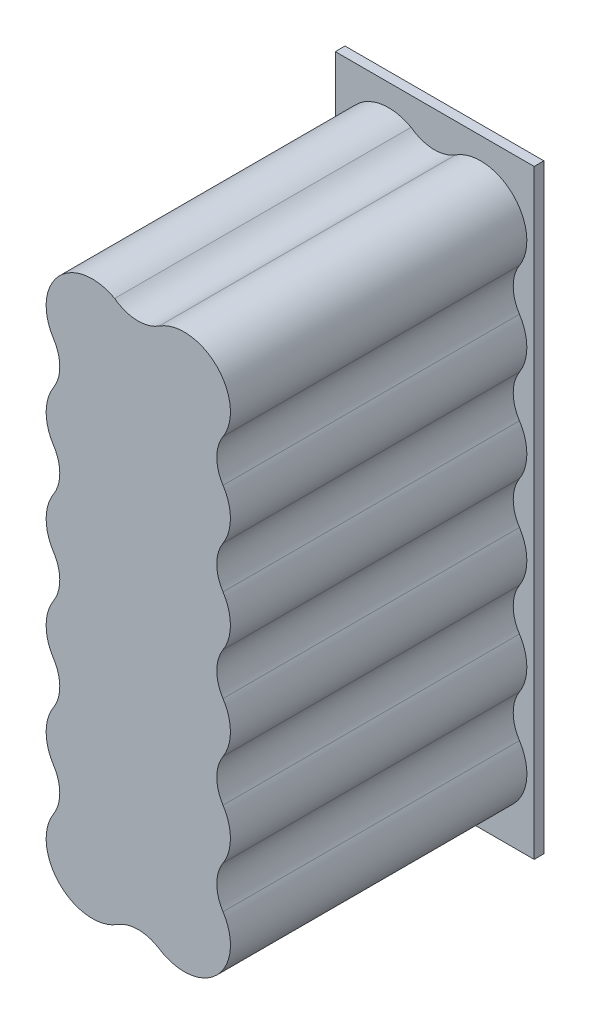
ISO-10303-21;
HEADER;
FILE_DESCRIPTION(('STEP AP214'),'2;1');
FILE_NAME('part.step','',(''),(''),'','','');
FILE_SCHEMA(('AUTOMOTIVE_DESIGN { 1 0 10303 214 1 1 1 1 }'));
ENDSEC;
DATA;
#1=APPLICATION_CONTEXT('core data for automotive mechanical design processes');
#2=APPLICATION_PROTOCOL_DEFINITION('international standard','automotive_design',2000,#1);
#3=PRODUCT_CONTEXT('',#1,'mechanical');
#4=PRODUCT('Part','Part','',(#3));
#5=PRODUCT_RELATED_PRODUCT_CATEGORY('part','',(#4));
#6=PRODUCT_DEFINITION_FORMATION('','',#4);
#7=PRODUCT_DEFINITION_CONTEXT('part definition',#1,'design');
#8=PRODUCT_DEFINITION('design','',#6,#7);
#9=PRODUCT_DEFINITION_SHAPE('','',#8);
#10=(LENGTH_UNIT() NAMED_UNIT(*) SI_UNIT(.MILLI.,.METRE.));
#11=(NAMED_UNIT(*) PLANE_ANGLE_UNIT() SI_UNIT($,.RADIAN.));
#12=(NAMED_UNIT(*) SI_UNIT($,.STERADIAN.) SOLID_ANGLE_UNIT());
#13=UNCERTAINTY_MEASURE_WITH_UNIT(LENGTH_MEASURE(1.E-05),#10,'distance_accuracy_value','');
#14=(GEOMETRIC_REPRESENTATION_CONTEXT(3) GLOBAL_UNCERTAINTY_ASSIGNED_CONTEXT((#13)) GLOBAL_UNIT_ASSIGNED_CONTEXT((#10,
#11,#12)) REPRESENTATION_CONTEXT('',''));
#15=CARTESIAN_POINT('',(0.,0.,0.));
#16=DIRECTION('',(0.,0.,1.));
#17=DIRECTION('',(1.,0.,0.));
#18=AXIS2_PLACEMENT_3D('',#15,#16,#17);
#19=CARTESIAN_POINT('',(0.639103561925076,46.8185253075974,61.));
#20=DIRECTION('',(0.,0.,-1.));
#21=DIRECTION('',(-1.,0.,0.));
#22=AXIS2_PLACEMENT_3D('',#19,#20,#21);
#23=CYLINDRICAL_SURFACE('',#22,8.);
#24=CARTESIAN_POINT('',(0.639103561925076,46.8185253075974,0.));
#25=DIRECTION('',(0.,0.,1.));
#26=DIRECTION('',(1.,0.,0.));
#27=AXIS2_PLACEMENT_3D('',#24,#25,#26);
#28=CIRCLE('',#27,8.);
#29=CARTESIAN_POINT('',(-4.18637409994036,40.4377130289892,0.));
#30=VERTEX_POINT('',#29);
#31=CARTESIAN_POINT('',(4.98196070478159,40.0999248702489,0.));
#32=VERTEX_POINT('',#31);
#33=EDGE_CURVE('E243',#30,#32,#28,.T.);
#34=ORIENTED_EDGE('',*,*,#33,.F.);
#35=DIRECTION('',(0.,0.,-1.));
#36=VECTOR('',#35,1.);
#37=CARTESIAN_POINT('',(-4.18637409994036,40.4377130289892,61.));
#38=LINE('',#37,#36);
#39=CARTESIAN_POINT('',(-4.18637409994036,40.4377130289892,61.));
#40=VERTEX_POINT('',#39);
#41=EDGE_CURVE('E11',#40,#30,#38,.T.);
#42=ORIENTED_EDGE('',*,*,#41,.F.);
#43=CARTESIAN_POINT('',(0.639103561925076,46.8185253075974,61.));
#44=DIRECTION('',(0.,0.,1.));
#45=DIRECTION('',(1.,0.,0.));
#46=AXIS2_PLACEMENT_3D('',#43,#44,#45);
#47=CIRCLE('',#46,8.);
#48=CARTESIAN_POINT('',(4.98196070478159,40.0999248702489,61.));
#49=VERTEX_POINT('',#48);
#50=EDGE_CURVE('E251',#40,#49,#47,.T.);
#51=ORIENTED_EDGE('',*,*,#50,.T.);
#52=DIRECTION('',(0.,0.,-1.));
#53=VECTOR('',#52,1.);
#54=CARTESIAN_POINT('',(4.98196070478159,40.0999248702489,61.));
#55=LINE('',#54,#53);
#56=EDGE_CURVE('E304',#49,#32,#55,.T.);
#57=ORIENTED_EDGE('',*,*,#56,.T.);
#58=EDGE_LOOP('',(#34,#42,#51,#57));
#59=FACE_BOUND('',#58,.T.);
#60=ADVANCED_FACE('F37',(#59),#23,.F.);
#61=CARTESIAN_POINT('',(-8.77898178948647,32.1215868508987,61.));
#62=DIRECTION('',(0.,0.,-1.));
#63=DIRECTION('',(-1.,0.,0.));
#64=AXIS2_PLACEMENT_3D('',#61,#62,#63);
#65=CYLINDRICAL_SURFACE('',#64,9.50000000000002);
#66=CARTESIAN_POINT('',(-8.77898178948647,32.1215868508987,0.));
#67=DIRECTION('',(0.,0.,1.));
#68=DIRECTION('',(1.,0.,0.));
#69=AXIS2_PLACEMENT_3D('',#66,#67,#68);
#70=CIRCLE('',#69,9.50000000000002);
#71=CARTESIAN_POINT('',(-16.8424232068559,27.0985486757848,0.));
#72=VERTEX_POINT('',#71);
#73=EDGE_CURVE('E245',#30,#72,#70,.T.);
#74=ORIENTED_EDGE('',*,*,#73,.T.);
#75=DIRECTION('',(0.,0.,-1.));
#76=VECTOR('',#75,1.);
#77=CARTESIAN_POINT('',(-16.8424232068559,27.0985486757848,61.));
#78=LINE('',#77,#76);
#79=CARTESIAN_POINT('',(-16.8424232068559,27.0985486757848,61.));
#80=VERTEX_POINT('',#79);
#81=EDGE_CURVE('E45',#80,#72,#78,.T.);
#82=ORIENTED_EDGE('',*,*,#81,.F.);
#83=CARTESIAN_POINT('',(-8.77898178948647,32.1215868508987,61.));
#84=DIRECTION('',(0.,0.,1.));
#85=DIRECTION('',(1.,0.,0.));
#86=AXIS2_PLACEMENT_3D('',#83,#84,#85);
#87=CIRCLE('',#86,9.50000000000002);
#88=EDGE_CURVE('E254',#40,#80,#87,.T.);
#89=ORIENTED_EDGE('',*,*,#88,.F.);
#90=ORIENTED_EDGE('',*,*,#41,.T.);
#91=EDGE_LOOP('',(#74,#82,#89,#90));
#92=FACE_BOUND('',#91,.T.);
#93=ADVANCED_FACE('F441',(#92),#65,.T.);
#94=CARTESIAN_POINT('',(-23.4742061491038,22.6242381135965,61.));
#95=DIRECTION('',(0.,0.,-1.));
#96=DIRECTION('',(-1.,0.,0.));
#97=AXIS2_PLACEMENT_3D('',#94,#95,#96);
#98=CYLINDRICAL_SURFACE('',#97,8.);
#99=CARTESIAN_POINT('',(-23.4742061491038,22.6242381135965,0.));
#100=DIRECTION('',(0.,0.,1.));
#101=DIRECTION('',(1.,0.,0.));
#102=AXIS2_PLACEMENT_3D('',#99,#100,#101);
#103=CIRCLE('',#102,8.);
#104=CARTESIAN_POINT('',(-16.7563892989923,18.2801689649336,0.));
#105=VERTEX_POINT('',#104);
#106=EDGE_CURVE('E308',#72,#105,#103,.F.);
#107=ORIENTED_EDGE('',*,*,#106,.T.);
#108=DIRECTION('',(0.,0.,-1.));
#109=VECTOR('',#108,1.);
#110=CARTESIAN_POINT('',(-16.7563892989923,18.2801689649336,61.));
#111=LINE('',#110,#109);
#112=CARTESIAN_POINT('',(-16.7563892989923,18.2801689649336,61.));
#113=VERTEX_POINT('',#112);
#114=EDGE_CURVE('E430',#113,#105,#111,.T.);
#115=ORIENTED_EDGE('',*,*,#114,.F.);
#116=CARTESIAN_POINT('',(-23.4742061491038,22.6242381135965,61.));
#117=DIRECTION('',(0.,0.,1.));
#118=DIRECTION('',(1.,0.,0.));
#119=AXIS2_PLACEMENT_3D('',#116,#117,#118);
#120=CIRCLE('',#119,8.);
#121=EDGE_CURVE('E257',#80,#113,#120,.F.);
#122=ORIENTED_EDGE('',*,*,#121,.F.);
#123=ORIENTED_EDGE('',*,*,#81,.T.);
#124=EDGE_LOOP('',(#107,#115,#122,#123));
#125=FACE_BOUND('',#124,.T.);
#126=ADVANCED_FACE('F436',(#125),#98,.F.);
#127=CARTESIAN_POINT('',(-8.77898178948629,13.1215868508973,61.));
#128=DIRECTION('',(0.,0.,-1.));
#129=DIRECTION('',(-1.,0.,0.));
#130=AXIS2_PLACEMENT_3D('',#127,#128,#129);
#131=CYLINDRICAL_SURFACE('',#130,9.49999999999882);
#132=CARTESIAN_POINT('',(-8.77898178948629,13.1215868508973,0.));
#133=DIRECTION('',(0.,0.,1.));
#134=DIRECTION('',(1.,0.,0.));
#135=AXIS2_PLACEMENT_3D('',#132,#133,#134);
#136=CIRCLE('',#135,9.49999999999882);
#137=CARTESIAN_POINT('',(-16.8424232068561,8.09854867578633,0.));
#138=VERTEX_POINT('',#137);
#139=EDGE_CURVE('E311',#105,#138,#136,.T.);
#140=ORIENTED_EDGE('',*,*,#139,.T.);
#141=DIRECTION('',(0.,0.,-1.));
#142=VECTOR('',#141,1.);
#143=CARTESIAN_POINT('',(-16.8424232068561,8.09854867578633,61.));
#144=LINE('',#143,#142);
#145=CARTESIAN_POINT('',(-16.8424232068561,8.09854867578633,61.));
#146=VERTEX_POINT('',#145);
#147=EDGE_CURVE('E427',#146,#138,#144,.T.);
#148=ORIENTED_EDGE('',*,*,#147,.F.);
#149=CARTESIAN_POINT('',(-8.77898178948629,13.1215868508973,61.));
#150=DIRECTION('',(0.,0.,1.));
#151=DIRECTION('',(1.,0.,0.));
#152=AXIS2_PLACEMENT_3D('',#149,#150,#151);
#153=CIRCLE('',#152,9.49999999999882);
#154=EDGE_CURVE('E259',#113,#146,#153,.T.);
#155=ORIENTED_EDGE('',*,*,#154,.F.);
#156=ORIENTED_EDGE('',*,*,#114,.T.);
#157=EDGE_LOOP('',(#140,#148,#155,#156));
#158=FACE_BOUND('',#157,.T.);
#159=ADVANCED_FACE('F447',(#158),#131,.T.);
#160=CARTESIAN_POINT('',(-23.4742061491036,3.62423811359826,61.));
#161=DIRECTION('',(0.,0.,-1.));
#162=DIRECTION('',(-1.,0.,0.));
#163=AXIS2_PLACEMENT_3D('',#160,#161,#162);
#164=CYLINDRICAL_SURFACE('',#163,8.00000000000009);
#165=CARTESIAN_POINT('',(-23.4742061491036,3.62423811359826,0.));
#166=DIRECTION('',(0.,0.,1.));
#167=DIRECTION('',(1.,0.,0.));
#168=AXIS2_PLACEMENT_3D('',#165,#166,#167);
#169=CIRCLE('',#168,8.00000000000009);
#170=CARTESIAN_POINT('',(-16.7563892989925,-0.719831035064275,0.));
#171=VERTEX_POINT('',#170);
#172=EDGE_CURVE('E314',#138,#171,#169,.F.);
#173=ORIENTED_EDGE('',*,*,#172,.T.);
#174=DIRECTION('',(0.,0.,-1.));
#175=VECTOR('',#174,1.);
#176=CARTESIAN_POINT('',(-16.7563892989925,-0.719831035064275,61.));
#177=LINE('',#176,#175);
#178=CARTESIAN_POINT('',(-16.7563892989925,-0.719831035064275,61.));
#179=VERTEX_POINT('',#178);
#180=EDGE_CURVE('E424',#179,#171,#177,.T.);
#181=ORIENTED_EDGE('',*,*,#180,.F.);
#182=CARTESIAN_POINT('',(-23.4742061491036,3.62423811359826,61.));
#183=DIRECTION('',(0.,0.,1.));
#184=DIRECTION('',(1.,0.,0.));
#185=AXIS2_PLACEMENT_3D('',#182,#183,#184);
#186=CIRCLE('',#185,8.00000000000009);
#187=EDGE_CURVE('E261',#146,#179,#186,.F.);
#188=ORIENTED_EDGE('',*,*,#187,.F.);
#189=ORIENTED_EDGE('',*,*,#147,.T.);
#190=EDGE_LOOP('',(#173,#181,#188,#189));
#191=FACE_BOUND('',#190,.T.);
#192=ADVANCED_FACE('F451',(#191),#164,.F.);
#193=CARTESIAN_POINT('',(-8.77898178948593,-5.87841314910006,61.));
#194=DIRECTION('',(0.,0.,-1.));
#195=DIRECTION('',(-1.,0.,0.));
#196=AXIS2_PLACEMENT_3D('',#193,#194,#195);
#197=CYLINDRICAL_SURFACE('',#196,9.49999999999903);
#198=CARTESIAN_POINT('',(-8.77898178948593,-5.87841314910006,0.));
#199=DIRECTION('',(0.,0.,1.));
#200=DIRECTION('',(1.,0.,0.));
#201=AXIS2_PLACEMENT_3D('',#198,#199,#200);
#202=CIRCLE('',#201,9.49999999999903);
#203=CARTESIAN_POINT('',(-16.8424232068553,-10.9014513242122,0.));
#204=VERTEX_POINT('',#203);
#205=EDGE_CURVE('E317',#171,#204,#202,.T.);
#206=ORIENTED_EDGE('',*,*,#205,.T.);
#207=DIRECTION('',(0.,0.,-1.));
#208=VECTOR('',#207,1.);
#209=CARTESIAN_POINT('',(-16.8424232068553,-10.9014513242122,61.));
#210=LINE('',#209,#208);
#211=CARTESIAN_POINT('',(-16.8424232068553,-10.9014513242122,61.));
#212=VERTEX_POINT('',#211);
#213=EDGE_CURVE('E421',#212,#204,#210,.T.);
#214=ORIENTED_EDGE('',*,*,#213,.F.);
#215=CARTESIAN_POINT('',(-8.77898178948593,-5.87841314910006,61.));
#216=DIRECTION('',(0.,0.,1.));
#217=DIRECTION('',(1.,0.,0.));
#218=AXIS2_PLACEMENT_3D('',#215,#216,#217);
#219=CIRCLE('',#218,9.49999999999903);
#220=EDGE_CURVE('E263',#179,#212,#219,.T.);
#221=ORIENTED_EDGE('',*,*,#220,.F.);
#222=ORIENTED_EDGE('',*,*,#180,.T.);
#223=EDGE_LOOP('',(#206,#214,#221,#222));
#224=FACE_BOUND('',#223,.T.);
#225=ADVANCED_FACE('F527',(#224),#197,.T.);
#226=CARTESIAN_POINT('',(-23.4742061491034,-15.3757618864006,61.));
#227=DIRECTION('',(0.,0.,-1.));
#228=DIRECTION('',(-1.,0.,0.));
#229=AXIS2_PLACEMENT_3D('',#226,#227,#228);
#230=CYLINDRICAL_SURFACE('',#229,8.);
#231=CARTESIAN_POINT('',(-23.4742061491034,-15.3757618864006,0.));
#232=DIRECTION('',(0.,0.,1.));
#233=DIRECTION('',(1.,0.,0.));
#234=AXIS2_PLACEMENT_3D('',#231,#232,#233);
#235=CIRCLE('',#234,8.);
#236=CARTESIAN_POINT('',(-16.7563892989921,-19.719831035063,0.));
#237=VERTEX_POINT('',#236);
#238=EDGE_CURVE('E320',#204,#237,#235,.F.);
#239=ORIENTED_EDGE('',*,*,#238,.T.);
#240=DIRECTION('',(0.,0.,-1.));
#241=VECTOR('',#240,1.);
#242=CARTESIAN_POINT('',(-16.7563892989921,-19.719831035063,61.));
#243=LINE('',#242,#241);
#244=CARTESIAN_POINT('',(-16.7563892989921,-19.719831035063,61.));
#245=VERTEX_POINT('',#244);
#246=EDGE_CURVE('E418',#245,#237,#243,.T.);
#247=ORIENTED_EDGE('',*,*,#246,.F.);
#248=CARTESIAN_POINT('',(-23.4742061491034,-15.3757618864006,61.));
#249=DIRECTION('',(0.,0.,1.));
#250=DIRECTION('',(1.,0.,0.));
#251=AXIS2_PLACEMENT_3D('',#248,#249,#250);
#252=CIRCLE('',#251,8.);
#253=EDGE_CURVE('E265',#212,#245,#252,.F.);
#254=ORIENTED_EDGE('',*,*,#253,.F.);
#255=ORIENTED_EDGE('',*,*,#213,.T.);
#256=EDGE_LOOP('',(#239,#247,#254,#255));
#257=FACE_BOUND('',#256,.T.);
#258=ADVANCED_FACE('F524',(#257),#230,.F.);
#259=CARTESIAN_POINT('',(-8.77898178948542,-24.8784131490991,61.));
#260=DIRECTION('',(0.,0.,-1.));
#261=DIRECTION('',(-1.,0.,0.));
#262=AXIS2_PLACEMENT_3D('',#259,#260,#261);
#263=CYLINDRICAL_SURFACE('',#262,9.49999999999929);
#264=CARTESIAN_POINT('',(-8.77898178948542,-24.8784131490991,0.));
#265=DIRECTION('',(0.,0.,1.));
#266=DIRECTION('',(1.,0.,0.));
#267=AXIS2_PLACEMENT_3D('',#264,#265,#266);
#268=CIRCLE('',#267,9.49999999999929);
#269=CARTESIAN_POINT('',(-16.8424232068553,-29.9014513242109,0.));
#270=VERTEX_POINT('',#269);
#271=EDGE_CURVE('E323',#237,#270,#268,.T.);
#272=ORIENTED_EDGE('',*,*,#271,.T.);
#273=DIRECTION('',(0.,0.,-1.));
#274=VECTOR('',#273,1.);
#275=CARTESIAN_POINT('',(-16.8424232068553,-29.9014513242109,61.));
#276=LINE('',#275,#274);
#277=CARTESIAN_POINT('',(-16.8424232068553,-29.9014513242109,61.));
#278=VERTEX_POINT('',#277);
#279=EDGE_CURVE('E415',#278,#270,#276,.T.);
#280=ORIENTED_EDGE('',*,*,#279,.F.);
#281=CARTESIAN_POINT('',(-8.77898178948542,-24.8784131490991,61.));
#282=DIRECTION('',(0.,0.,1.));
#283=DIRECTION('',(1.,0.,0.));
#284=AXIS2_PLACEMENT_3D('',#281,#282,#283);
#285=CIRCLE('',#284,9.49999999999929);
#286=EDGE_CURVE('E267',#245,#278,#285,.T.);
#287=ORIENTED_EDGE('',*,*,#286,.F.);
#288=ORIENTED_EDGE('',*,*,#246,.T.);
#289=EDGE_LOOP('',(#272,#280,#287,#288));
#290=FACE_BOUND('',#289,.T.);
#291=ADVANCED_FACE('F521',(#290),#263,.T.);
#292=CARTESIAN_POINT('',(-23.4742061491032,-34.3757618863992,61.));
#293=DIRECTION('',(0.,0.,-1.));
#294=DIRECTION('',(-1.,0.,0.));
#295=AXIS2_PLACEMENT_3D('',#292,#293,#294);
#296=CYLINDRICAL_SURFACE('',#295,8.);
#297=CARTESIAN_POINT('',(-23.4742061491032,-34.3757618863992,0.));
#298=DIRECTION('',(0.,0.,1.));
#299=DIRECTION('',(1.,0.,0.));
#300=AXIS2_PLACEMENT_3D('',#297,#298,#299);
#301=CIRCLE('',#300,8.);
#302=CARTESIAN_POINT('',(-16.7563892989919,-38.7198310350616,0.));
#303=VERTEX_POINT('',#302);
#304=EDGE_CURVE('E326',#270,#303,#301,.F.);
#305=ORIENTED_EDGE('',*,*,#304,.T.);
#306=DIRECTION('',(0.,0.,-1.));
#307=VECTOR('',#306,1.);
#308=CARTESIAN_POINT('',(-16.7563892989919,-38.7198310350616,61.));
#309=LINE('',#308,#307);
#310=CARTESIAN_POINT('',(-16.7563892989919,-38.7198310350616,61.));
#311=VERTEX_POINT('',#310);
#312=EDGE_CURVE('E412',#311,#303,#309,.T.);
#313=ORIENTED_EDGE('',*,*,#312,.F.);
#314=CARTESIAN_POINT('',(-23.4742061491032,-34.3757618863992,61.));
#315=DIRECTION('',(0.,0.,1.));
#316=DIRECTION('',(1.,0.,0.));
#317=AXIS2_PLACEMENT_3D('',#314,#315,#316);
#318=CIRCLE('',#317,8.);
#319=EDGE_CURVE('E269',#278,#311,#318,.F.);
#320=ORIENTED_EDGE('',*,*,#319,.F.);
#321=ORIENTED_EDGE('',*,*,#279,.T.);
#322=EDGE_LOOP('',(#305,#313,#320,#321));
#323=FACE_BOUND('',#322,.T.);
#324=ADVANCED_FACE('F516',(#323),#296,.F.);
#325=CARTESIAN_POINT('',(-8.77898178948344,-43.8784131490977,61.));
#326=DIRECTION('',(0.,0.,-1.));
#327=DIRECTION('',(-1.,0.,0.));
#328=AXIS2_PLACEMENT_3D('',#325,#326,#327);
#329=CYLINDRICAL_SURFACE('',#328,9.5000000000008);
#330=CARTESIAN_POINT('',(-8.77898178948344,-43.8784131490977,0.));
#331=DIRECTION('',(0.,0.,1.));
#332=DIRECTION('',(1.,0.,0.));
#333=AXIS2_PLACEMENT_3D('',#330,#331,#332);
#334=CIRCLE('',#333,9.5000000000008);
#335=CARTESIAN_POINT('',(-16.8424232068551,-48.9014513242095,0.));
#336=VERTEX_POINT('',#335);
#337=EDGE_CURVE('E329',#303,#336,#334,.T.);
#338=ORIENTED_EDGE('',*,*,#337,.T.);
#339=DIRECTION('',(0.,0.,-1.));
#340=VECTOR('',#339,1.);
#341=CARTESIAN_POINT('',(-16.8424232068551,-48.9014513242095,61.));
#342=LINE('',#341,#340);
#343=CARTESIAN_POINT('',(-16.8424232068551,-48.9014513242095,61.));
#344=VERTEX_POINT('',#343);
#345=EDGE_CURVE('E409',#344,#336,#342,.T.);
#346=ORIENTED_EDGE('',*,*,#345,.F.);
#347=CARTESIAN_POINT('',(-8.77898178948344,-43.8784131490977,61.));
#348=DIRECTION('',(0.,0.,1.));
#349=DIRECTION('',(1.,0.,0.));
#350=AXIS2_PLACEMENT_3D('',#347,#348,#349);
#351=CIRCLE('',#350,9.5000000000008);
#352=EDGE_CURVE('E271',#311,#344,#351,.T.);
#353=ORIENTED_EDGE('',*,*,#352,.F.);
#354=ORIENTED_EDGE('',*,*,#312,.T.);
#355=EDGE_LOOP('',(#338,#346,#353,#354));
#356=FACE_BOUND('',#355,.T.);
#357=ADVANCED_FACE('F513',(#356),#329,.T.);
#358=CARTESIAN_POINT('',(-23.474206149103,-53.3757618863978,61.));
#359=DIRECTION('',(0.,0.,-1.));
#360=DIRECTION('',(-1.,0.,0.));
#361=AXIS2_PLACEMENT_3D('',#358,#359,#360);
#362=CYLINDRICAL_SURFACE('',#361,8.);
#363=CARTESIAN_POINT('',(-23.474206149103,-53.3757618863978,0.));
#364=DIRECTION('',(0.,0.,1.));
#365=DIRECTION('',(1.,0.,0.));
#366=AXIS2_PLACEMENT_3D('',#363,#364,#365);
#367=CIRCLE('',#366,8.);
#368=CARTESIAN_POINT('',(-16.7563892989917,-57.7198310350601,0.));
#369=VERTEX_POINT('',#368);
#370=EDGE_CURVE('E332',#336,#369,#367,.F.);
#371=ORIENTED_EDGE('',*,*,#370,.T.);
#372=DIRECTION('',(0.,0.,-1.));
#373=VECTOR('',#372,1.);
#374=CARTESIAN_POINT('',(-16.7563892989917,-57.7198310350601,61.));
#375=LINE('',#374,#373);
#376=CARTESIAN_POINT('',(-16.7563892989917,-57.7198310350601,61.));
#377=VERTEX_POINT('',#376);
#378=EDGE_CURVE('E406',#377,#369,#375,.T.);
#379=ORIENTED_EDGE('',*,*,#378,.F.);
#380=CARTESIAN_POINT('',(-23.474206149103,-53.3757618863978,61.));
#381=DIRECTION('',(0.,0.,1.));
#382=DIRECTION('',(1.,0.,0.));
#383=AXIS2_PLACEMENT_3D('',#380,#381,#382);
#384=CIRCLE('',#383,8.);
#385=EDGE_CURVE('E273',#344,#377,#384,.F.);
#386=ORIENTED_EDGE('',*,*,#385,.F.);
#387=ORIENTED_EDGE('',*,*,#345,.T.);
#388=EDGE_LOOP('',(#371,#379,#386,#387));
#389=FACE_BOUND('',#388,.T.);
#390=ADVANCED_FACE('F509',(#389),#362,.F.);
#391=CARTESIAN_POINT('',(-8.77898178948529,-62.8784131490982,61.));
#392=DIRECTION('',(0.,0.,-1.));
#393=DIRECTION('',(-1.,0.,0.));
#394=AXIS2_PLACEMENT_3D('',#391,#392,#393);
#395=CYLINDRICAL_SURFACE('',#394,9.50000000000013);
#396=CARTESIAN_POINT('',(-8.77898178948529,-62.8784131490982,0.));
#397=DIRECTION('',(0.,0.,1.));
#398=DIRECTION('',(1.,0.,0.));
#399=AXIS2_PLACEMENT_3D('',#396,#397,#398);
#400=CIRCLE('',#399,9.50000000000013);
#401=CARTESIAN_POINT('',(-3.65330569529198,-70.8770033109591,0.));
#402=VERTEX_POINT('',#401);
#403=EDGE_CURVE('E335',#369,#402,#400,.T.);
#404=ORIENTED_EDGE('',*,*,#403,.T.);
#405=DIRECTION('',(0.,0.,-1.));
#406=VECTOR('',#405,1.);
#407=CARTESIAN_POINT('',(-3.65330569529198,-70.8770033109591,61.));
#408=LINE('',#407,#406);
#409=CARTESIAN_POINT('',(-3.65330569529198,-70.8770033109591,61.));
#410=VERTEX_POINT('',#409);
#411=EDGE_CURVE('E403',#410,#402,#408,.T.);
#412=ORIENTED_EDGE('',*,*,#411,.F.);
#413=CARTESIAN_POINT('',(-8.77898178948529,-62.8784131490982,61.));
#414=DIRECTION('',(0.,0.,1.));
#415=DIRECTION('',(1.,0.,0.));
#416=AXIS2_PLACEMENT_3D('',#413,#414,#415);
#417=CIRCLE('',#416,9.50000000000013);
#418=EDGE_CURVE('E275',#377,#410,#417,.T.);
#419=ORIENTED_EDGE('',*,*,#418,.F.);
#420=ORIENTED_EDGE('',*,*,#378,.T.);
#421=EDGE_LOOP('',(#404,#412,#419,#420));
#422=FACE_BOUND('',#421,.T.);
#423=ADVANCED_FACE('F507',(#422),#395,.T.);
#424=CARTESIAN_POINT('',(0.663053120870756,-77.612658184105,61.));
#425=DIRECTION('',(0.,0.,-1.));
#426=DIRECTION('',(-1.,0.,0.));
#427=AXIS2_PLACEMENT_3D('',#424,#425,#426);
#428=CYLINDRICAL_SURFACE('',#427,8.);
#429=CARTESIAN_POINT('',(0.663053120870756,-77.612658184105,0.));
#430=DIRECTION('',(0.,0.,1.));
#431=DIRECTION('',(1.,0.,0.));
#432=AXIS2_PLACEMENT_3D('',#429,#430,#431);
#433=CIRCLE('',#432,8.);
#434=CARTESIAN_POINT('',(4.99317655585941,-70.8858438535499,0.));
#435=VERTEX_POINT('',#434);
#436=EDGE_CURVE('E338',#402,#435,#433,.F.);
#437=ORIENTED_EDGE('',*,*,#436,.T.);
#438=DIRECTION('',(0.,0.,-1.));
#439=VECTOR('',#438,1.);
#440=CARTESIAN_POINT('',(4.99317655585941,-70.8858438535499,61.));
#441=LINE('',#440,#439);
#442=CARTESIAN_POINT('',(4.99317655585941,-70.8858438535499,61.));
#443=VERTEX_POINT('',#442);
#444=EDGE_CURVE('E400',#443,#435,#441,.T.);
#445=ORIENTED_EDGE('',*,*,#444,.F.);
#446=CARTESIAN_POINT('',(0.663053120870756,-77.612658184105,61.));
#447=DIRECTION('',(0.,0.,1.));
#448=DIRECTION('',(1.,0.,0.));
#449=AXIS2_PLACEMENT_3D('',#446,#447,#448);
#450=CIRCLE('',#449,8.);
#451=EDGE_CURVE('E277',#410,#443,#450,.F.);
#452=ORIENTED_EDGE('',*,*,#451,.F.);
#453=ORIENTED_EDGE('',*,*,#411,.T.);
#454=EDGE_LOOP('',(#437,#445,#452,#453));
#455=FACE_BOUND('',#454,.T.);
#456=ADVANCED_FACE('F498',(#455),#428,.F.);
#457=CARTESIAN_POINT('',(10.1391023646144,-62.8916866444022,61.));
#458=DIRECTION('',(0.,0.,-1.));
#459=DIRECTION('',(-1.,0.,0.));
#460=AXIS2_PLACEMENT_3D('',#457,#458,#459);
#461=CYLINDRICAL_SURFACE('',#460,9.50721315180103);
#462=CARTESIAN_POINT('',(10.1391023646144,-62.8916866444022,0.));
#463=DIRECTION('',(0.,0.,1.));
#464=DIRECTION('',(1.,0.,0.));
#465=AXIS2_PLACEMENT_3D('',#462,#463,#464);
#466=CIRCLE('',#465,9.50721315180103);
#467=CARTESIAN_POINT('',(18.1174415812756,-57.7212702919539,0.));
#468=VERTEX_POINT('',#467);
#469=EDGE_CURVE('E341',#435,#468,#466,.T.);
#470=ORIENTED_EDGE('',*,*,#469,.T.);
#471=DIRECTION('',(0.,0.,-1.));
#472=VECTOR('',#471,1.);
#473=CARTESIAN_POINT('',(18.1174415812756,-57.7212702919539,61.));
#474=LINE('',#473,#472);
#475=CARTESIAN_POINT('',(18.1174415812756,-57.7212702919539,61.));
#476=VERTEX_POINT('',#475);
#477=EDGE_CURVE('E397',#476,#468,#474,.T.);
#478=ORIENTED_EDGE('',*,*,#477,.F.);
#479=CARTESIAN_POINT('',(10.1391023646144,-62.8916866444022,61.));
#480=DIRECTION('',(0.,0.,1.));
#481=DIRECTION('',(1.,0.,0.));
#482=AXIS2_PLACEMENT_3D('',#479,#480,#481);
#483=CIRCLE('',#482,9.50721315180103);
#484=EDGE_CURVE('E279',#443,#476,#483,.T.);
#485=ORIENTED_EDGE('',*,*,#484,.F.);
#486=ORIENTED_EDGE('',*,*,#444,.T.);
#487=EDGE_LOOP('',(#470,#478,#485,#486));
#488=FACE_BOUND('',#487,.T.);
#489=ADVANCED_FACE('F502',(#488),#461,.T.);
#490=CARTESIAN_POINT('',(24.8360420186237,-53.3784131490966,61.));
#491=DIRECTION('',(0.,0.,-1.));
#492=DIRECTION('',(-1.,0.,0.));
#493=AXIS2_PLACEMENT_3D('',#490,#491,#492);
#494=CYLINDRICAL_SURFACE('',#493,8.);
#495=CARTESIAN_POINT('',(24.8360420186237,-53.3784131490966,0.));
#496=DIRECTION('',(0.,0.,1.));
#497=DIRECTION('',(1.,0.,0.));
#498=AXIS2_PLACEMENT_3D('',#495,#496,#497);
#499=CIRCLE('',#498,8.);
#500=CARTESIAN_POINT('',(18.1174415812755,-49.0355560062396,0.));
#501=VERTEX_POINT('',#500);
#502=EDGE_CURVE('E344',#501,#468,#499,.T.);
#503=ORIENTED_EDGE('',*,*,#502,.F.);
#504=DIRECTION('',(0.,0.,-1.));
#505=VECTOR('',#504,1.);
#506=CARTESIAN_POINT('',(18.1174415812755,-49.0355560062396,61.));
#507=LINE('',#506,#505);
#508=CARTESIAN_POINT('',(18.1174415812755,-49.0355560062396,61.));
#509=VERTEX_POINT('',#508);
#510=EDGE_CURVE('E394',#509,#501,#507,.T.);
#511=ORIENTED_EDGE('',*,*,#510,.F.);
#512=CARTESIAN_POINT('',(24.8360420186237,-53.3784131490966,61.));
#513=DIRECTION('',(0.,0.,1.));
#514=DIRECTION('',(1.,0.,0.));
#515=AXIS2_PLACEMENT_3D('',#512,#513,#514);
#516=CIRCLE('',#515,8.);
#517=EDGE_CURVE('E281',#509,#476,#516,.T.);
#518=ORIENTED_EDGE('',*,*,#517,.T.);
#519=ORIENTED_EDGE('',*,*,#477,.T.);
#520=EDGE_LOOP('',(#503,#511,#518,#519));
#521=FACE_BOUND('',#520,.T.);
#522=ADVANCED_FACE('F493',(#521),#494,.F.);
#523=CARTESIAN_POINT('',(10.139103561925,-43.8784131490975,61.));
#524=DIRECTION('',(0.,0.,-1.));
#525=DIRECTION('',(-1.,0.,0.));
#526=AXIS2_PLACEMENT_3D('',#523,#524,#525);
#527=CYLINDRICAL_SURFACE('',#526,9.4999999999992);
#528=CARTESIAN_POINT('',(10.139103561925,-43.8784131490975,0.));
#529=DIRECTION('',(0.,0.,1.));
#530=DIRECTION('',(1.,0.,0.));
#531=AXIS2_PLACEMENT_3D('',#528,#529,#530);
#532=CIRCLE('',#531,9.4999999999992);
#533=CARTESIAN_POINT('',(18.1174415812754,-38.7212702919553,0.));
#534=VERTEX_POINT('',#533);
#535=EDGE_CURVE('E346',#501,#534,#532,.T.);
#536=ORIENTED_EDGE('',*,*,#535,.T.);
#537=DIRECTION('',(0.,0.,-1.));
#538=VECTOR('',#537,1.);
#539=CARTESIAN_POINT('',(18.1174415812754,-38.7212702919553,61.));
#540=LINE('',#539,#538);
#541=CARTESIAN_POINT('',(18.1174415812754,-38.7212702919553,61.));
#542=VERTEX_POINT('',#541);
#543=EDGE_CURVE('E391',#542,#534,#540,.T.);
#544=ORIENTED_EDGE('',*,*,#543,.F.);
#545=CARTESIAN_POINT('',(10.139103561925,-43.8784131490975,61.));
#546=DIRECTION('',(0.,0.,1.));
#547=DIRECTION('',(1.,0.,0.));
#548=AXIS2_PLACEMENT_3D('',#545,#546,#547);
#549=CIRCLE('',#548,9.4999999999992);
#550=EDGE_CURVE('E284',#509,#542,#549,.T.);
#551=ORIENTED_EDGE('',*,*,#550,.F.);
#552=ORIENTED_EDGE('',*,*,#510,.T.);
#553=EDGE_LOOP('',(#536,#544,#551,#552));
#554=FACE_BOUND('',#553,.T.);
#555=ADVANCED_FACE('F489',(#554),#527,.T.);
#556=CARTESIAN_POINT('',(24.8360420186235,-34.3784131490981,61.));
#557=DIRECTION('',(0.,0.,-1.));
#558=DIRECTION('',(-1.,0.,0.));
#559=AXIS2_PLACEMENT_3D('',#556,#557,#558);
#560=CYLINDRICAL_SURFACE('',#559,8.);
#561=CARTESIAN_POINT('',(24.8360420186235,-34.3784131490981,0.));
#562=DIRECTION('',(0.,0.,1.));
#563=DIRECTION('',(1.,0.,0.));
#564=AXIS2_PLACEMENT_3D('',#561,#562,#563);
#565=CIRCLE('',#564,8.);
#566=CARTESIAN_POINT('',(18.1174415812753,-30.035556006241,0.));
#567=VERTEX_POINT('',#566);
#568=EDGE_CURVE('E349',#567,#534,#565,.T.);
#569=ORIENTED_EDGE('',*,*,#568,.F.);
#570=DIRECTION('',(0.,0.,-1.));
#571=VECTOR('',#570,1.);
#572=CARTESIAN_POINT('',(18.1174415812753,-30.035556006241,61.));
#573=LINE('',#572,#571);
#574=CARTESIAN_POINT('',(18.1174415812753,-30.035556006241,61.));
#575=VERTEX_POINT('',#574);
#576=EDGE_CURVE('E388',#575,#567,#573,.T.);
#577=ORIENTED_EDGE('',*,*,#576,.F.);
#578=CARTESIAN_POINT('',(24.8360420186235,-34.3784131490981,61.));
#579=DIRECTION('',(0.,0.,1.));
#580=DIRECTION('',(1.,0.,0.));
#581=AXIS2_PLACEMENT_3D('',#578,#579,#580);
#582=CIRCLE('',#581,8.);
#583=EDGE_CURVE('E286',#575,#542,#582,.T.);
#584=ORIENTED_EDGE('',*,*,#583,.T.);
#585=ORIENTED_EDGE('',*,*,#543,.T.);
#586=EDGE_LOOP('',(#569,#577,#584,#585));
#587=FACE_BOUND('',#586,.T.);
#588=ADVANCED_FACE('F485',(#587),#560,.F.);
#589=CARTESIAN_POINT('',(10.1391035619245,-24.8784131490989,61.));
#590=DIRECTION('',(0.,0.,-1.));
#591=DIRECTION('',(-1.,0.,0.));
#592=AXIS2_PLACEMENT_3D('',#589,#590,#591);
#593=CYLINDRICAL_SURFACE('',#592,9.49999999999945);
#594=CARTESIAN_POINT('',(10.1391035619245,-24.8784131490989,0.));
#595=DIRECTION('',(0.,0.,1.));
#596=DIRECTION('',(1.,0.,0.));
#597=AXIS2_PLACEMENT_3D('',#594,#595,#596);
#598=CIRCLE('',#597,9.49999999999945);
#599=CARTESIAN_POINT('',(18.1174415812752,-19.7212702919567,0.));
#600=VERTEX_POINT('',#599);
#601=EDGE_CURVE('E351',#567,#600,#598,.T.);
#602=ORIENTED_EDGE('',*,*,#601,.T.);
#603=DIRECTION('',(0.,0.,-1.));
#604=VECTOR('',#603,1.);
#605=CARTESIAN_POINT('',(18.1174415812752,-19.7212702919567,61.));
#606=LINE('',#605,#604);
#607=CARTESIAN_POINT('',(18.1174415812752,-19.7212702919567,61.));
#608=VERTEX_POINT('',#607);
#609=EDGE_CURVE('E385',#608,#600,#606,.T.);
#610=ORIENTED_EDGE('',*,*,#609,.F.);
#611=CARTESIAN_POINT('',(10.1391035619245,-24.8784131490989,61.));
#612=DIRECTION('',(0.,0.,1.));
#613=DIRECTION('',(1.,0.,0.));
#614=AXIS2_PLACEMENT_3D('',#611,#612,#613);
#615=CIRCLE('',#614,9.49999999999945);
#616=EDGE_CURVE('E289',#575,#608,#615,.T.);
#617=ORIENTED_EDGE('',*,*,#616,.F.);
#618=ORIENTED_EDGE('',*,*,#576,.T.);
#619=EDGE_LOOP('',(#602,#610,#617,#618));
#620=FACE_BOUND('',#619,.T.);
#621=ADVANCED_FACE('F481',(#620),#593,.T.);
#622=CARTESIAN_POINT('',(24.8360420186233,-15.3784131490995,61.));
#623=DIRECTION('',(0.,0.,-1.));
#624=DIRECTION('',(-1.,0.,0.));
#625=AXIS2_PLACEMENT_3D('',#622,#623,#624);
#626=CYLINDRICAL_SURFACE('',#625,8.);
#627=CARTESIAN_POINT('',(24.8360420186233,-15.3784131490995,0.));
#628=DIRECTION('',(0.,0.,1.));
#629=DIRECTION('',(1.,0.,0.));
#630=AXIS2_PLACEMENT_3D('',#627,#628,#629);
#631=CIRCLE('',#630,8.);
#632=CARTESIAN_POINT('',(18.1174415812751,-11.0355560062424,0.));
#633=VERTEX_POINT('',#632);
#634=EDGE_CURVE('E354',#633,#600,#631,.T.);
#635=ORIENTED_EDGE('',*,*,#634,.F.);
#636=DIRECTION('',(0.,0.,-1.));
#637=VECTOR('',#636,1.);
#638=CARTESIAN_POINT('',(18.1174415812751,-11.0355560062424,61.));
#639=LINE('',#638,#637);
#640=CARTESIAN_POINT('',(18.1174415812751,-11.0355560062424,61.));
#641=VERTEX_POINT('',#640);
#642=EDGE_CURVE('E382',#641,#633,#639,.T.);
#643=ORIENTED_EDGE('',*,*,#642,.F.);
#644=CARTESIAN_POINT('',(24.8360420186233,-15.3784131490995,61.));
#645=DIRECTION('',(0.,0.,1.));
#646=DIRECTION('',(1.,0.,0.));
#647=AXIS2_PLACEMENT_3D('',#644,#645,#646);
#648=CIRCLE('',#647,8.);
#649=EDGE_CURVE('E291',#641,#608,#648,.T.);
#650=ORIENTED_EDGE('',*,*,#649,.T.);
#651=ORIENTED_EDGE('',*,*,#609,.T.);
#652=EDGE_LOOP('',(#635,#643,#650,#651));
#653=FACE_BOUND('',#652,.T.);
#654=ADVANCED_FACE('F477',(#653),#626,.F.);
#655=CARTESIAN_POINT('',(10.1391035619227,-5.87841314910036,61.));
#656=DIRECTION('',(0.,0.,-1.));
#657=DIRECTION('',(-1.,0.,0.));
#658=AXIS2_PLACEMENT_3D('',#655,#656,#657);
#659=CYLINDRICAL_SURFACE('',#658,9.50000000000099);
#660=CARTESIAN_POINT('',(10.1391035619227,-5.87841314910036,0.));
#661=DIRECTION('',(0.,0.,1.));
#662=DIRECTION('',(1.,0.,0.));
#663=AXIS2_PLACEMENT_3D('',#660,#661,#662);
#664=CIRCLE('',#663,9.50000000000099);
#665=CARTESIAN_POINT('',(18.1174415812753,-0.721270291958189,0.));
#666=VERTEX_POINT('',#665);
#667=EDGE_CURVE('E356',#633,#666,#664,.T.);
#668=ORIENTED_EDGE('',*,*,#667,.T.);
#669=DIRECTION('',(0.,0.,-1.));
#670=VECTOR('',#669,1.);
#671=CARTESIAN_POINT('',(18.1174415812753,-0.721270291958189,61.));
#672=LINE('',#671,#670);
#673=CARTESIAN_POINT('',(18.1174415812753,-0.721270291958189,61.));
#674=VERTEX_POINT('',#673);
#675=EDGE_CURVE('E379',#674,#666,#672,.T.);
#676=ORIENTED_EDGE('',*,*,#675,.F.);
#677=CARTESIAN_POINT('',(10.1391035619227,-5.87841314910036,61.));
#678=DIRECTION('',(0.,0.,1.));
#679=DIRECTION('',(1.,0.,0.));
#680=AXIS2_PLACEMENT_3D('',#677,#678,#679);
#681=CIRCLE('',#680,9.50000000000099);
#682=EDGE_CURVE('E294',#641,#674,#681,.T.);
#683=ORIENTED_EDGE('',*,*,#682,.F.);
#684=ORIENTED_EDGE('',*,*,#642,.T.);
#685=EDGE_LOOP('',(#668,#676,#683,#684));
#686=FACE_BOUND('',#685,.T.);
#687=ADVANCED_FACE('F474',(#686),#659,.T.);
#688=CARTESIAN_POINT('',(24.8360420186231,3.62158685089941,61.));
#689=DIRECTION('',(0.,0.,-1.));
#690=DIRECTION('',(-1.,0.,0.));
#691=AXIS2_PLACEMENT_3D('',#688,#689,#690);
#692=CYLINDRICAL_SURFACE('',#691,7.9999999999999);
#693=CARTESIAN_POINT('',(24.8360420186231,3.62158685089941,0.));
#694=DIRECTION('',(0.,0.,1.));
#695=DIRECTION('',(1.,0.,0.));
#696=AXIS2_PLACEMENT_3D('',#693,#694,#695);
#697=CIRCLE('',#696,7.9999999999999);
#698=CARTESIAN_POINT('',(18.117441581275,7.96444399375643,0.));
#699=VERTEX_POINT('',#698);
#700=EDGE_CURVE('E359',#699,#666,#697,.T.);
#701=ORIENTED_EDGE('',*,*,#700,.F.);
#702=DIRECTION('',(0.,0.,-1.));
#703=VECTOR('',#702,1.);
#704=CARTESIAN_POINT('',(18.117441581275,7.96444399375643,61.));
#705=LINE('',#704,#703);
#706=CARTESIAN_POINT('',(18.117441581275,7.96444399375643,61.));
#707=VERTEX_POINT('',#706);
#708=EDGE_CURVE('E376',#707,#699,#705,.T.);
#709=ORIENTED_EDGE('',*,*,#708,.F.);
#710=CARTESIAN_POINT('',(24.8360420186231,3.62158685089941,61.));
#711=DIRECTION('',(0.,0.,1.));
#712=DIRECTION('',(1.,0.,0.));
#713=AXIS2_PLACEMENT_3D('',#710,#711,#712);
#714=CIRCLE('',#713,7.9999999999999);
#715=EDGE_CURVE('E296',#707,#674,#714,.T.);
#716=ORIENTED_EDGE('',*,*,#715,.T.);
#717=ORIENTED_EDGE('',*,*,#675,.T.);
#718=EDGE_LOOP('',(#701,#709,#716,#717));
#719=FACE_BOUND('',#718,.T.);
#720=ADVANCED_FACE('F469',(#719),#692,.F.);
#721=CARTESIAN_POINT('',(10.1391035619239,13.1215868508975,61.));
#722=DIRECTION('',(0.,0.,-1.));
#723=DIRECTION('',(-1.,0.,0.));
#724=AXIS2_PLACEMENT_3D('',#721,#722,#723);
#725=CYLINDRICAL_SURFACE('',#724,9.49999999999952);
#726=CARTESIAN_POINT('',(10.1391035619239,13.1215868508975,0.));
#727=DIRECTION('',(0.,0.,1.));
#728=DIRECTION('',(1.,0.,0.));
#729=AXIS2_PLACEMENT_3D('',#726,#727,#728);
#730=CIRCLE('',#729,9.49999999999952);
#731=CARTESIAN_POINT('',(18.1174415812748,18.2787297080404,0.));
#732=VERTEX_POINT('',#731);
#733=EDGE_CURVE('E361',#699,#732,#730,.T.);
#734=ORIENTED_EDGE('',*,*,#733,.T.);
#735=DIRECTION('',(0.,0.,-1.));
#736=VECTOR('',#735,1.);
#737=CARTESIAN_POINT('',(18.1174415812748,18.2787297080404,61.));
#738=LINE('',#737,#736);
#739=CARTESIAN_POINT('',(18.1174415812748,18.2787297080404,61.));
#740=VERTEX_POINT('',#739);
#741=EDGE_CURVE('E373',#740,#732,#738,.T.);
#742=ORIENTED_EDGE('',*,*,#741,.F.);
#743=CARTESIAN_POINT('',(10.1391035619239,13.1215868508975,61.));
#744=DIRECTION('',(0.,0.,1.));
#745=DIRECTION('',(1.,0.,0.));
#746=AXIS2_PLACEMENT_3D('',#743,#744,#745);
#747=CIRCLE('',#746,9.49999999999952);
#748=EDGE_CURVE('E299',#707,#740,#747,.T.);
#749=ORIENTED_EDGE('',*,*,#748,.F.);
#750=ORIENTED_EDGE('',*,*,#708,.T.);
#751=EDGE_LOOP('',(#734,#742,#749,#750));
#752=FACE_BOUND('',#751,.T.);
#753=ADVANCED_FACE('F465',(#752),#725,.T.);
#754=CARTESIAN_POINT('',(24.8360420186229,22.6215868508976,61.));
#755=DIRECTION('',(0.,0.,-1.));
#756=DIRECTION('',(-1.,0.,0.));
#757=AXIS2_PLACEMENT_3D('',#754,#755,#756);
#758=CYLINDRICAL_SURFACE('',#757,8.);
#759=CARTESIAN_POINT('',(24.8360420186229,22.6215868508976,0.));
#760=DIRECTION('',(0.,0.,1.));
#761=DIRECTION('',(1.,0.,0.));
#762=AXIS2_PLACEMENT_3D('',#759,#760,#761);
#763=CIRCLE('',#762,8.);
#764=CARTESIAN_POINT('',(18.1174415812747,26.9644439937547,0.));
#765=VERTEX_POINT('',#764);
#766=EDGE_CURVE('E364',#765,#732,#763,.T.);
#767=ORIENTED_EDGE('',*,*,#766,.F.);
#768=DIRECTION('',(0.,0.,-1.));
#769=VECTOR('',#768,1.);
#770=CARTESIAN_POINT('',(18.1174415812747,26.9644439937547,61.));
#771=LINE('',#770,#769);
#772=CARTESIAN_POINT('',(18.1174415812747,26.9644439937547,61.));
#773=VERTEX_POINT('',#772);
#774=EDGE_CURVE('E370',#773,#765,#771,.T.);
#775=ORIENTED_EDGE('',*,*,#774,.F.);
#776=CARTESIAN_POINT('',(24.8360420186229,22.6215868508976,61.));
#777=DIRECTION('',(0.,0.,1.));
#778=DIRECTION('',(1.,0.,0.));
#779=AXIS2_PLACEMENT_3D('',#776,#777,#778);
#780=CIRCLE('',#779,8.);
#781=EDGE_CURVE('E301',#773,#740,#780,.T.);
#782=ORIENTED_EDGE('',*,*,#781,.T.);
#783=ORIENTED_EDGE('',*,*,#741,.T.);
#784=EDGE_LOOP('',(#767,#775,#782,#783));
#785=FACE_BOUND('',#784,.T.);
#786=ADVANCED_FACE('F462',(#785),#758,.F.);
#787=CARTESIAN_POINT('',(10.1391035619237,32.1215868508975,61.));
#788=DIRECTION('',(0.,0.,-1.));
#789=DIRECTION('',(-1.,0.,0.));
#790=AXIS2_PLACEMENT_3D('',#787,#788,#789);
#791=CYLINDRICAL_SURFACE('',#790,9.5);
#792=CARTESIAN_POINT('',(10.1391035619237,32.1215868508975,0.));
#793=DIRECTION('',(0.,0.,1.));
#794=DIRECTION('',(1.,0.,0.));
#795=AXIS2_PLACEMENT_3D('',#792,#793,#794);
#796=CIRCLE('',#795,9.5);
#797=EDGE_CURVE('E255',#765,#32,#796,.T.);
#798=ORIENTED_EDGE('',*,*,#797,.T.);
#799=ORIENTED_EDGE('',*,*,#56,.F.);
#800=CARTESIAN_POINT('',(10.1391035619237,32.1215868508975,61.));
#801=DIRECTION('',(0.,0.,1.));
#802=DIRECTION('',(1.,0.,0.));
#803=AXIS2_PLACEMENT_3D('',#800,#801,#802);
#804=CIRCLE('',#803,9.5);
#805=EDGE_CURVE('E52',#773,#49,#804,.T.);
#806=ORIENTED_EDGE('',*,*,#805,.F.);
#807=ORIENTED_EDGE('',*,*,#774,.T.);
#808=EDGE_LOOP('',(#798,#799,#806,#807));
#809=FACE_BOUND('',#808,.T.);
#810=ADVANCED_FACE('F458',(#809),#791,.T.);
#811=CARTESIAN_POINT('',(0.,0.,61.));
#812=DIRECTION('',(0.,0.,1.));
#813=DIRECTION('',(1.,0.,0.));
#814=AXIS2_PLACEMENT_3D('',#811,#812,#813);
#815=PLANE('',#814);
#816=ORIENTED_EDGE('',*,*,#50,.F.);
#817=ORIENTED_EDGE('',*,*,#88,.T.);
#818=ORIENTED_EDGE('',*,*,#121,.T.);
#819=ORIENTED_EDGE('',*,*,#154,.T.);
#820=ORIENTED_EDGE('',*,*,#187,.T.);
#821=ORIENTED_EDGE('',*,*,#220,.T.);
#822=ORIENTED_EDGE('',*,*,#253,.T.);
#823=ORIENTED_EDGE('',*,*,#286,.T.);
#824=ORIENTED_EDGE('',*,*,#319,.T.);
#825=ORIENTED_EDGE('',*,*,#352,.T.);
#826=ORIENTED_EDGE('',*,*,#385,.T.);
#827=ORIENTED_EDGE('',*,*,#418,.T.);
#828=ORIENTED_EDGE('',*,*,#451,.T.);
#829=ORIENTED_EDGE('',*,*,#484,.T.);
#830=ORIENTED_EDGE('',*,*,#517,.F.);
#831=ORIENTED_EDGE('',*,*,#550,.T.);
#832=ORIENTED_EDGE('',*,*,#583,.F.);
#833=ORIENTED_EDGE('',*,*,#616,.T.);
#834=ORIENTED_EDGE('',*,*,#649,.F.);
#835=ORIENTED_EDGE('',*,*,#682,.T.);
#836=ORIENTED_EDGE('',*,*,#715,.F.);
#837=ORIENTED_EDGE('',*,*,#748,.T.);
#838=ORIENTED_EDGE('',*,*,#781,.F.);
#839=ORIENTED_EDGE('',*,*,#805,.T.);
#840=EDGE_LOOP('',(#816,#817,#818,#819,#820,#821,#822,#823,#824,#825,#826,#827,#828,#829,#830,
#831,#832,#833,#834,#835,#836,#837,#838,#839));
#841=FACE_BOUND('',#840,.T.);
#842=ADVANCED_FACE('F454',(#841),#815,.T.);
#843=CARTESIAN_POINT('',(0.,0.,0.));
#844=DIRECTION('',(0.,0.,-1.));
#845=DIRECTION('',(-1.,0.,0.));
#846=AXIS2_PLACEMENT_3D('',#843,#844,#845);
#847=PLANE('',#846);
#848=DIRECTION('',(0.,-1.,0.));
#849=VECTOR('',#848,1.);
#850=CARTESIAN_POINT('',(21.1391035619237,46.1215868508987,0.));
#851=LINE('',#850,#849);
#852=CARTESIAN_POINT('',(21.1391035619237,46.1215868508987,0.));
#853=VERTEX_POINT('',#852);
#854=CARTESIAN_POINT('',(21.1391035619237,-77.3784131490982,0.));
#855=VERTEX_POINT('',#854);
#856=EDGE_CURVE('E242',#853,#855,#851,.T.);
#857=ORIENTED_EDGE('',*,*,#856,.F.);
#858=DIRECTION('',(1.,0.,0.));
#859=VECTOR('',#858,1.);
#860=CARTESIAN_POINT('',(21.1391035619237,46.1215868508987,0.));
#861=LINE('',#860,#859);
#862=CARTESIAN_POINT('',(-19.7789817894865,46.1215868508987,0.));
#863=VERTEX_POINT('',#862);
#864=EDGE_CURVE('E238',#863,#853,#861,.T.);
#865=ORIENTED_EDGE('',*,*,#864,.F.);
#866=DIRECTION('',(0.,1.,0.));
#867=VECTOR('',#866,1.);
#868=CARTESIAN_POINT('',(-19.7789817894865,46.1215868508987,0.));
#869=LINE('',#868,#867);
#870=CARTESIAN_POINT('',(-19.7789817894865,-77.3784131490982,0.));
#871=VERTEX_POINT('',#870);
#872=EDGE_CURVE('E799',#871,#863,#869,.T.);
#873=ORIENTED_EDGE('',*,*,#872,.F.);
#874=DIRECTION('',(-1.,0.,0.));
#875=VECTOR('',#874,1.);
#876=CARTESIAN_POINT('',(21.1391035619237,-77.3784131490982,0.));
#877=LINE('',#876,#875);
#878=EDGE_CURVE('E802',#855,#871,#877,.T.);
#879=ORIENTED_EDGE('',*,*,#878,.F.);
#880=EDGE_LOOP('',(#857,#865,#873,#879));
#881=FACE_BOUND('',#880,.T.);
#882=ORIENTED_EDGE('',*,*,#73,.F.);
#883=ORIENTED_EDGE('',*,*,#33,.T.);
#884=ORIENTED_EDGE('',*,*,#797,.F.);
#885=ORIENTED_EDGE('',*,*,#766,.T.);
#886=ORIENTED_EDGE('',*,*,#733,.F.);
#887=ORIENTED_EDGE('',*,*,#700,.T.);
#888=ORIENTED_EDGE('',*,*,#667,.F.);
#889=ORIENTED_EDGE('',*,*,#634,.T.);
#890=ORIENTED_EDGE('',*,*,#601,.F.);
#891=ORIENTED_EDGE('',*,*,#568,.T.);
#892=ORIENTED_EDGE('',*,*,#535,.F.);
#893=ORIENTED_EDGE('',*,*,#502,.T.);
#894=ORIENTED_EDGE('',*,*,#469,.F.);
#895=ORIENTED_EDGE('',*,*,#436,.F.);
#896=ORIENTED_EDGE('',*,*,#403,.F.);
#897=ORIENTED_EDGE('',*,*,#370,.F.);
#898=ORIENTED_EDGE('',*,*,#337,.F.);
#899=ORIENTED_EDGE('',*,*,#304,.F.);
#900=ORIENTED_EDGE('',*,*,#271,.F.);
#901=ORIENTED_EDGE('',*,*,#238,.F.);
#902=ORIENTED_EDGE('',*,*,#205,.F.);
#903=ORIENTED_EDGE('',*,*,#172,.F.);
#904=ORIENTED_EDGE('',*,*,#139,.F.);
#905=ORIENTED_EDGE('',*,*,#106,.F.);
#906=EDGE_LOOP('',(#882,#883,#884,#885,#886,#887,#888,#889,#890,#891,#892,#893,#894,#895,#896,
#897,#898,#899,#900,#901,#902,#903,#904,#905));
#907=FACE_BOUND('',#906,.T.);
#908=ADVANCED_FACE('F444',(#881,#907),#847,.F.);
#909=CARTESIAN_POINT('',(21.1391035619237,46.1215868508987,-2.));
#910=DIRECTION('',(-1.,0.,0.));
#911=DIRECTION('',(0.,-1.,0.));
#912=AXIS2_PLACEMENT_3D('',#909,#910,#911);
#913=PLANE('',#912);
#914=ORIENTED_EDGE('',*,*,#856,.T.);
#915=DIRECTION('',(0.,0.,1.));
#916=VECTOR('',#915,1.);
#917=CARTESIAN_POINT('',(21.1391035619237,-77.3784131490982,-2.));
#918=LINE('',#917,#916);
#919=CARTESIAN_POINT('',(21.1391035619237,-77.3784131490982,-2.));
#920=VERTEX_POINT('',#919);
#921=EDGE_CURVE('E222',#920,#855,#918,.T.);
#922=ORIENTED_EDGE('',*,*,#921,.F.);
#923=DIRECTION('',(0.,-1.,0.));
#924=VECTOR('',#923,1.);
#925=CARTESIAN_POINT('',(21.1391035619237,46.1215868508987,-2.));
#926=LINE('',#925,#924);
#927=CARTESIAN_POINT('',(21.1391035619237,46.1215868508987,-2.));
#928=VERTEX_POINT('',#927);
#929=EDGE_CURVE('E229',#928,#920,#926,.T.);
#930=ORIENTED_EDGE('',*,*,#929,.F.);
#931=DIRECTION('',(0.,0.,1.));
#932=VECTOR('',#931,1.);
#933=CARTESIAN_POINT('',(21.1391035619237,46.1215868508987,-2.));
#934=LINE('',#933,#932);
#935=EDGE_CURVE('E796',#928,#853,#934,.T.);
#936=ORIENTED_EDGE('',*,*,#935,.T.);
#937=EDGE_LOOP('',(#914,#922,#930,#936));
#938=FACE_BOUND('',#937,.T.);
#939=ADVANCED_FACE('F240',(#938),#913,.F.);
#940=CARTESIAN_POINT('',(21.1391035619237,-77.3784131490982,-2.));
#941=DIRECTION('',(0.,1.,0.));
#942=DIRECTION('',(0.,0.,1.));
#943=AXIS2_PLACEMENT_3D('',#940,#941,#942);
#944=PLANE('',#943);
#945=ORIENTED_EDGE('',*,*,#878,.T.);
#946=DIRECTION('',(0.,0.,1.));
#947=VECTOR('',#946,1.);
#948=CARTESIAN_POINT('',(-19.7789817894865,-77.3784131490982,-2.));
#949=LINE('',#948,#947);
#950=CARTESIAN_POINT('',(-19.7789817894865,-77.3784131490982,-2.));
#951=VERTEX_POINT('',#950);
#952=EDGE_CURVE('E225',#951,#871,#949,.T.);
#953=ORIENTED_EDGE('',*,*,#952,.F.);
#954=DIRECTION('',(-1.,0.,0.));
#955=VECTOR('',#954,1.);
#956=CARTESIAN_POINT('',(21.1391035619237,-77.3784131490982,-2.));
#957=LINE('',#956,#955);
#958=EDGE_CURVE('E218',#920,#951,#957,.T.);
#959=ORIENTED_EDGE('',*,*,#958,.F.);
#960=ORIENTED_EDGE('',*,*,#921,.T.);
#961=EDGE_LOOP('',(#945,#953,#959,#960));
#962=FACE_BOUND('',#961,.T.);
#963=ADVANCED_FACE('F220',(#962),#944,.F.);
#964=CARTESIAN_POINT('',(-19.7789817894865,46.1215868508987,-2.));
#965=DIRECTION('',(1.,0.,0.));
#966=DIRECTION('',(0.,1.,0.));
#967=AXIS2_PLACEMENT_3D('',#964,#965,#966);
#968=PLANE('',#967);
#969=ORIENTED_EDGE('',*,*,#872,.T.);
#970=DIRECTION('',(0.,0.,1.));
#971=VECTOR('',#970,1.);
#972=CARTESIAN_POINT('',(-19.7789817894865,46.1215868508987,-2.));
#973=LINE('',#972,#971);
#974=CARTESIAN_POINT('',(-19.7789817894865,46.1215868508987,-2.));
#975=VERTEX_POINT('',#974);
#976=EDGE_CURVE('E247',#975,#863,#973,.T.);
#977=ORIENTED_EDGE('',*,*,#976,.F.);
#978=DIRECTION('',(0.,1.,0.));
#979=VECTOR('',#978,1.);
#980=CARTESIAN_POINT('',(-19.7789817894865,46.1215868508987,-2.));
#981=LINE('',#980,#979);
#982=EDGE_CURVE('E228',#951,#975,#981,.T.);
#983=ORIENTED_EDGE('',*,*,#982,.F.);
#984=ORIENTED_EDGE('',*,*,#952,.T.);
#985=EDGE_LOOP('',(#969,#977,#983,#984));
#986=FACE_BOUND('',#985,.T.);
#987=ADVANCED_FACE('F729',(#986),#968,.F.);
#988=CARTESIAN_POINT('',(21.1391035619237,46.1215868508987,-2.));
#989=DIRECTION('',(0.,-1.,0.));
#990=DIRECTION('',(0.,0.,-1.));
#991=AXIS2_PLACEMENT_3D('',#988,#989,#990);
#992=PLANE('',#991);
#993=ORIENTED_EDGE('',*,*,#864,.T.);
#994=ORIENTED_EDGE('',*,*,#935,.F.);
#995=DIRECTION('',(1.,0.,0.));
#996=VECTOR('',#995,1.);
#997=CARTESIAN_POINT('',(21.1391035619237,46.1215868508987,-2.));
#998=LINE('',#997,#996);
#999=EDGE_CURVE('E234',#975,#928,#998,.T.);
#1000=ORIENTED_EDGE('',*,*,#999,.F.);
#1001=ORIENTED_EDGE('',*,*,#976,.T.);
#1002=EDGE_LOOP('',(#993,#994,#1000,#1001));
#1003=FACE_BOUND('',#1002,.T.);
#1004=ADVANCED_FACE('F738',(#1003),#992,.F.);
#1005=CARTESIAN_POINT('',(0.,0.,-2.));
#1006=DIRECTION('',(0.,0.,-1.));
#1007=DIRECTION('',(-1.,0.,0.));
#1008=AXIS2_PLACEMENT_3D('',#1005,#1006,#1007);
#1009=PLANE('',#1008);
#1010=ORIENTED_EDGE('',*,*,#929,.T.);
#1011=ORIENTED_EDGE('',*,*,#958,.T.);
#1012=ORIENTED_EDGE('',*,*,#982,.T.);
#1013=ORIENTED_EDGE('',*,*,#999,.T.);
#1014=EDGE_LOOP('',(#1010,#1011,#1012,#1013));
#1015=FACE_BOUND('',#1014,.T.);
#1016=ADVANCED_FACE('F232',(#1015),#1009,.T.);
#1017=CLOSED_SHELL('',(#60,#93,#126,#159,#192,#225,#258,#291,#324,#357,#390,#423,#456,#489,#522,
#555,#588,#621,#654,#687,#720,#753,#786,#810,#842,#908,#939,#963,#987,#1004,#1016));
#1018=MANIFOLD_SOLID_BREP('B2',#1017);
#1019=ADVANCED_BREP_SHAPE_REPRESENTATION('',(#18,#1018),#14);
#1020=SHAPE_DEFINITION_REPRESENTATION(#9,#1019);
ENDSEC;
END-ISO-10303-21;
